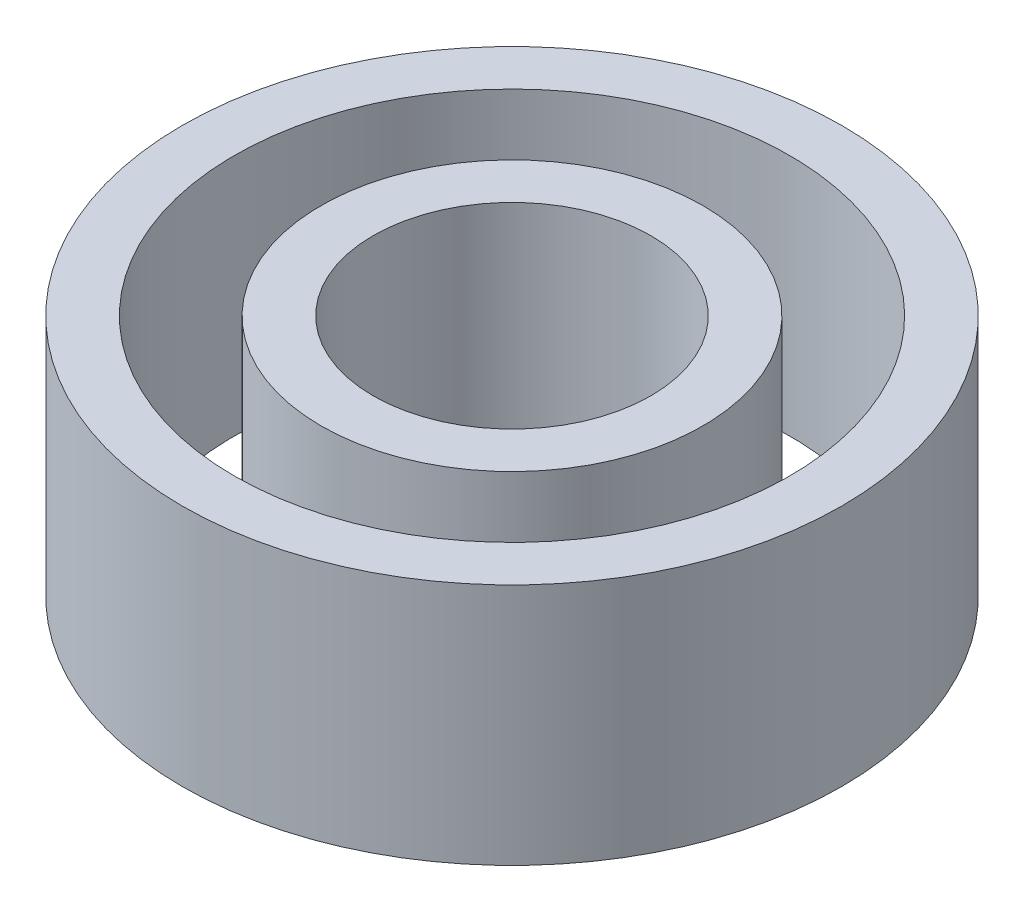
ISO-10303-21;
HEADER;
FILE_DESCRIPTION(('STEP AP214'),'2;1');
FILE_NAME('part.step','',(''),(''),'','','');
FILE_SCHEMA(('AUTOMOTIVE_DESIGN { 1 0 10303 214 1 1 1 1 }'));
ENDSEC;
DATA;
#1=APPLICATION_CONTEXT('core data for automotive mechanical design processes');
#2=APPLICATION_PROTOCOL_DEFINITION('international standard','automotive_design',2000,#1);
#3=PRODUCT_CONTEXT('',#1,'mechanical');
#4=PRODUCT('Part','Part','',(#3));
#5=PRODUCT_RELATED_PRODUCT_CATEGORY('part','',(#4));
#6=PRODUCT_DEFINITION_FORMATION('','',#4);
#7=PRODUCT_DEFINITION_CONTEXT('part definition',#1,'design');
#8=PRODUCT_DEFINITION('design','',#6,#7);
#9=PRODUCT_DEFINITION_SHAPE('','',#8);
#10=(LENGTH_UNIT() NAMED_UNIT(*) SI_UNIT(.MILLI.,.METRE.));
#11=(NAMED_UNIT(*) PLANE_ANGLE_UNIT() SI_UNIT($,.RADIAN.));
#12=(NAMED_UNIT(*) SI_UNIT($,.STERADIAN.) SOLID_ANGLE_UNIT());
#13=UNCERTAINTY_MEASURE_WITH_UNIT(LENGTH_MEASURE(1.E-05),#10,'distance_accuracy_value','');
#14=(GEOMETRIC_REPRESENTATION_CONTEXT(3) GLOBAL_UNCERTAINTY_ASSIGNED_CONTEXT((#13)) GLOBAL_UNIT_ASSIGNED_CONTEXT((#10,
#11,#12)) REPRESENTATION_CONTEXT('',''));
#15=CARTESIAN_POINT('',(0.,0.,0.));
#16=DIRECTION('',(0.,0.,1.));
#17=DIRECTION('',(1.,0.,0.));
#18=AXIS2_PLACEMENT_3D('',#15,#16,#17);
#19=CARTESIAN_POINT('',(0.,7.,0.));
#20=DIRECTION('',(0.,-1.,0.));
#21=DIRECTION('',(0.,0.,-1.));
#22=AXIS2_PLACEMENT_3D('',#19,#20,#21);
#23=CYLINDRICAL_SURFACE('',#22,8.);
#24=CARTESIAN_POINT('',(0.,7.,0.));
#25=DIRECTION('',(0.,1.,0.));
#26=DIRECTION('',(0.,0.,1.));
#27=AXIS2_PLACEMENT_3D('',#24,#25,#26);
#28=CIRCLE('',#27,8.);
#29=CARTESIAN_POINT('',(0.,7.,8.));
#30=VERTEX_POINT('',#29);
#31=EDGE_CURVE('E61',#30,#30,#28,.T.);
#32=ORIENTED_EDGE('',*,*,#31,.T.);
#33=EDGE_LOOP('',(#32));
#34=FACE_BOUND('',#33,.T.);
#35=CARTESIAN_POINT('',(0.,0.,0.));
#36=DIRECTION('',(0.,1.,0.));
#37=DIRECTION('',(0.,0.,1.));
#38=AXIS2_PLACEMENT_3D('',#35,#36,#37);
#39=CIRCLE('',#38,8.);
#40=CARTESIAN_POINT('',(0.,0.,8.));
#41=VERTEX_POINT('',#40);
#42=EDGE_CURVE('E68',#41,#41,#39,.T.);
#43=ORIENTED_EDGE('',*,*,#42,.F.);
#44=EDGE_LOOP('',(#43));
#45=FACE_BOUND('',#44,.T.);
#46=ADVANCED_FACE('F53',(#34,#45),#23,.F.);
#47=CARTESIAN_POINT('',(0.,7.,0.));
#48=DIRECTION('',(0.,-1.,0.));
#49=DIRECTION('',(0.,0.,-1.));
#50=AXIS2_PLACEMENT_3D('',#47,#48,#49);
#51=CYLINDRICAL_SURFACE('',#50,9.5);
#52=CARTESIAN_POINT('',(0.,7.,0.));
#53=DIRECTION('',(0.,1.,0.));
#54=DIRECTION('',(0.,0.,1.));
#55=AXIS2_PLACEMENT_3D('',#52,#53,#54);
#56=CIRCLE('',#55,9.5);
#57=CARTESIAN_POINT('',(0.,7.,9.5));
#58=VERTEX_POINT('',#57);
#59=EDGE_CURVE('E12',#58,#58,#56,.T.);
#60=ORIENTED_EDGE('',*,*,#59,.F.);
#61=EDGE_LOOP('',(#60));
#62=FACE_BOUND('',#61,.T.);
#63=CARTESIAN_POINT('',(0.,0.,0.));
#64=DIRECTION('',(0.,1.,0.));
#65=DIRECTION('',(0.,0.,1.));
#66=AXIS2_PLACEMENT_3D('',#63,#64,#65);
#67=CIRCLE('',#66,9.5);
#68=CARTESIAN_POINT('',(0.,0.,9.5));
#69=VERTEX_POINT('',#68);
#70=EDGE_CURVE('E56',#69,#69,#67,.T.);
#71=ORIENTED_EDGE('',*,*,#70,.T.);
#72=EDGE_LOOP('',(#71));
#73=FACE_BOUND('',#72,.T.);
#74=ADVANCED_FACE('F77',(#62,#73),#51,.T.);
#75=CARTESIAN_POINT('',(0.,7.,0.));
#76=DIRECTION('',(0.,1.,0.));
#77=DIRECTION('',(0.,0.,1.));
#78=AXIS2_PLACEMENT_3D('',#75,#76,#77);
#79=PLANE('',#78);
#80=ORIENTED_EDGE('',*,*,#31,.F.);
#81=EDGE_LOOP('',(#80));
#82=FACE_BOUND('',#81,.T.);
#83=ORIENTED_EDGE('',*,*,#59,.T.);
#84=EDGE_LOOP('',(#83));
#85=FACE_BOUND('',#84,.T.);
#86=ADVANCED_FACE('F81',(#82,#85),#79,.T.);
#87=CARTESIAN_POINT('',(0.,0.,0.));
#88=DIRECTION('',(0.,1.,0.));
#89=DIRECTION('',(0.,0.,1.));
#90=AXIS2_PLACEMENT_3D('',#87,#88,#89);
#91=PLANE('',#90);
#92=ORIENTED_EDGE('',*,*,#42,.T.);
#93=EDGE_LOOP('',(#92));
#94=FACE_BOUND('',#93,.T.);
#95=ORIENTED_EDGE('',*,*,#70,.F.);
#96=EDGE_LOOP('',(#95));
#97=FACE_BOUND('',#96,.T.);
#98=ADVANCED_FACE('F79',(#94,#97),#91,.F.);
#99=CLOSED_SHELL('',(#46,#74,#86,#98));
#100=MANIFOLD_SOLID_BREP('B2',#99);
#101=CARTESIAN_POINT('',(0.,7.,0.));
#102=DIRECTION('',(0.,-1.,0.));
#103=DIRECTION('',(0.,0.,-1.));
#104=AXIS2_PLACEMENT_3D('',#101,#102,#103);
#105=CYLINDRICAL_SURFACE('',#104,4.);
#106=CARTESIAN_POINT('',(0.,7.,0.));
#107=DIRECTION('',(0.,1.,0.));
#108=DIRECTION('',(0.,0.,1.));
#109=AXIS2_PLACEMENT_3D('',#106,#107,#108);
#110=CIRCLE('',#109,4.);
#111=CARTESIAN_POINT('',(0.,7.,4.));
#112=VERTEX_POINT('',#111);
#113=EDGE_CURVE('E126',#112,#112,#110,.T.);
#114=ORIENTED_EDGE('',*,*,#113,.T.);
#115=EDGE_LOOP('',(#114));
#116=FACE_BOUND('',#115,.T.);
#117=CARTESIAN_POINT('',(0.,0.,0.));
#118=DIRECTION('',(0.,1.,0.));
#119=DIRECTION('',(0.,0.,1.));
#120=AXIS2_PLACEMENT_3D('',#117,#118,#119);
#121=CIRCLE('',#120,4.);
#122=CARTESIAN_POINT('',(0.,0.,4.));
#123=VERTEX_POINT('',#122);
#124=EDGE_CURVE('E132',#123,#123,#121,.T.);
#125=ORIENTED_EDGE('',*,*,#124,.F.);
#126=EDGE_LOOP('',(#125));
#127=FACE_BOUND('',#126,.T.);
#128=ADVANCED_FACE('F119',(#116,#127),#105,.F.);
#129=CARTESIAN_POINT('',(0.,7.,0.));
#130=DIRECTION('',(0.,-1.,0.));
#131=DIRECTION('',(0.,0.,-1.));
#132=AXIS2_PLACEMENT_3D('',#129,#130,#131);
#133=CYLINDRICAL_SURFACE('',#132,5.5);
#134=CARTESIAN_POINT('',(0.,7.,0.));
#135=DIRECTION('',(0.,1.,0.));
#136=DIRECTION('',(0.,0.,1.));
#137=AXIS2_PLACEMENT_3D('',#134,#135,#136);
#138=CIRCLE('',#137,5.5);
#139=CARTESIAN_POINT('',(0.,7.,5.5));
#140=VERTEX_POINT('',#139);
#141=EDGE_CURVE('E52',#140,#140,#138,.T.);
#142=ORIENTED_EDGE('',*,*,#141,.F.);
#143=EDGE_LOOP('',(#142));
#144=FACE_BOUND('',#143,.T.);
#145=CARTESIAN_POINT('',(0.,0.,0.));
#146=DIRECTION('',(0.,1.,0.));
#147=DIRECTION('',(0.,0.,1.));
#148=AXIS2_PLACEMENT_3D('',#145,#146,#147);
#149=CIRCLE('',#148,5.5);
#150=CARTESIAN_POINT('',(0.,0.,5.5));
#151=VERTEX_POINT('',#150);
#152=EDGE_CURVE('E122',#151,#151,#149,.T.);
#153=ORIENTED_EDGE('',*,*,#152,.T.);
#154=EDGE_LOOP('',(#153));
#155=FACE_BOUND('',#154,.T.);
#156=ADVANCED_FACE('F139',(#144,#155),#133,.T.);
#157=CARTESIAN_POINT('',(0.,7.,0.));
#158=DIRECTION('',(0.,1.,0.));
#159=DIRECTION('',(0.,0.,1.));
#160=AXIS2_PLACEMENT_3D('',#157,#158,#159);
#161=PLANE('',#160);
#162=ORIENTED_EDGE('',*,*,#113,.F.);
#163=EDGE_LOOP('',(#162));
#164=FACE_BOUND('',#163,.T.);
#165=ORIENTED_EDGE('',*,*,#141,.T.);
#166=EDGE_LOOP('',(#165));
#167=FACE_BOUND('',#166,.T.);
#168=ADVANCED_FACE('F143',(#164,#167),#161,.T.);
#169=CARTESIAN_POINT('',(0.,0.,0.));
#170=DIRECTION('',(0.,1.,0.));
#171=DIRECTION('',(0.,0.,1.));
#172=AXIS2_PLACEMENT_3D('',#169,#170,#171);
#173=PLANE('',#172);
#174=ORIENTED_EDGE('',*,*,#124,.T.);
#175=EDGE_LOOP('',(#174));
#176=FACE_BOUND('',#175,.T.);
#177=ORIENTED_EDGE('',*,*,#152,.F.);
#178=EDGE_LOOP('',(#177));
#179=FACE_BOUND('',#178,.T.);
#180=ADVANCED_FACE('F141',(#176,#179),#173,.F.);
#181=CLOSED_SHELL('',(#128,#156,#168,#180));
#182=MANIFOLD_SOLID_BREP('B7',#181);
#183=ADVANCED_BREP_SHAPE_REPRESENTATION('',(#18,#100,#182),#14);
#184=SHAPE_DEFINITION_REPRESENTATION(#9,#183);
ENDSEC;
END-ISO-10303-21;
